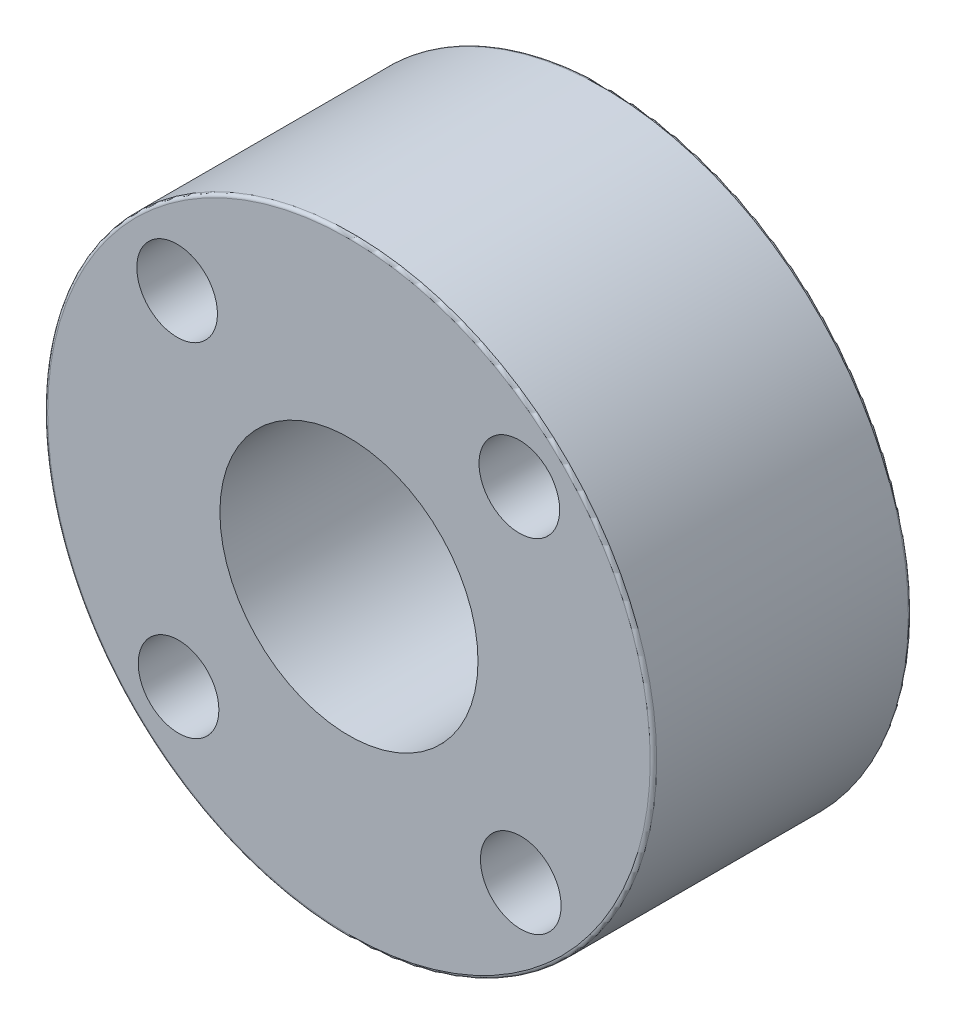
ISO-10303-21;
HEADER;
FILE_DESCRIPTION(('STEP AP214'),'2;1');
FILE_NAME('part.step','',(''),(''),'','','');
FILE_SCHEMA(('AUTOMOTIVE_DESIGN { 1 0 10303 214 1 1 1 1 }'));
ENDSEC;
DATA;
#1=APPLICATION_CONTEXT('core data for automotive mechanical design processes');
#2=APPLICATION_PROTOCOL_DEFINITION('international standard','automotive_design',2000,#1);
#3=PRODUCT_CONTEXT('',#1,'mechanical');
#4=PRODUCT('Part','Part','',(#3));
#5=PRODUCT_RELATED_PRODUCT_CATEGORY('part','',(#4));
#6=PRODUCT_DEFINITION_FORMATION('','',#4);
#7=PRODUCT_DEFINITION_CONTEXT('part definition',#1,'design');
#8=PRODUCT_DEFINITION('design','',#6,#7);
#9=PRODUCT_DEFINITION_SHAPE('','',#8);
#10=(LENGTH_UNIT() NAMED_UNIT(*) SI_UNIT(.MILLI.,.METRE.));
#11=(NAMED_UNIT(*) PLANE_ANGLE_UNIT() SI_UNIT($,.RADIAN.));
#12=(NAMED_UNIT(*) SI_UNIT($,.STERADIAN.) SOLID_ANGLE_UNIT());
#13=UNCERTAINTY_MEASURE_WITH_UNIT(LENGTH_MEASURE(1.E-05),#10,'distance_accuracy_value','');
#14=(GEOMETRIC_REPRESENTATION_CONTEXT(3) GLOBAL_UNCERTAINTY_ASSIGNED_CONTEXT((#13)) GLOBAL_UNIT_ASSIGNED_CONTEXT((#10,
#11,#12)) REPRESENTATION_CONTEXT('',''));
#15=CARTESIAN_POINT('',(0.,0.,0.));
#16=DIRECTION('',(0.,0.,1.));
#17=DIRECTION('',(1.,0.,0.));
#18=AXIS2_PLACEMENT_3D('',#15,#16,#17);
#19=CARTESIAN_POINT('',(0.,0.,8.));
#20=DIRECTION('',(0.,0.,1.));
#21=DIRECTION('',(1.,0.,0.));
#22=AXIS2_PLACEMENT_3D('',#19,#20,#21);
#23=PLANE('',#22);
#24=CARTESIAN_POINT('',(0.,0.,8.));
#25=DIRECTION('',(0.,0.,1.));
#26=DIRECTION('',(1.,0.,0.));
#27=AXIS2_PLACEMENT_3D('',#24,#25,#26);
#28=CIRCLE('',#27,9.33812854036816);
#29=CARTESIAN_POINT('',(9.33812854036816,0.,8.));
#30=VERTEX_POINT('',#29);
#31=EDGE_CURVE('E12',#30,#30,#28,.T.);
#32=ORIENTED_EDGE('',*,*,#31,.T.);
#33=EDGE_LOOP('',(#32));
#34=FACE_BOUND('',#33,.T.);
#35=CARTESIAN_POINT('',(5.32517198398644,-5.28133916170599,8.));
#36=DIRECTION('',(0.,0.,1.));
#37=DIRECTION('',(1.,0.,0.));
#38=AXIS2_PLACEMENT_3D('',#35,#36,#37);
#39=CIRCLE('',#38,1.25);
#40=CARTESIAN_POINT('',(6.57517198398644,-5.28133916170599,8.));
#41=VERTEX_POINT('',#40);
#42=EDGE_CURVE('E93',#41,#41,#39,.T.);
#43=ORIENTED_EDGE('',*,*,#42,.F.);
#44=EDGE_LOOP('',(#43));
#45=FACE_BOUND('',#44,.T.);
#46=CARTESIAN_POINT('',(-5.3251719839858,5.28133916170599,8.));
#47=DIRECTION('',(0.,0.,1.));
#48=DIRECTION('',(1.,0.,0.));
#49=AXIS2_PLACEMENT_3D('',#46,#47,#48);
#50=CIRCLE('',#49,1.25);
#51=CARTESIAN_POINT('',(-4.07517198398581,5.28133916170599,8.));
#52=VERTEX_POINT('',#51);
#53=EDGE_CURVE('E77',#52,#52,#50,.T.);
#54=ORIENTED_EDGE('',*,*,#53,.F.);
#55=EDGE_LOOP('',(#54));
#56=FACE_BOUND('',#55,.T.);
#57=CARTESIAN_POINT('',(0.,0.,8.));
#58=DIRECTION('',(0.,0.,1.));
#59=DIRECTION('',(1.,0.,0.));
#60=AXIS2_PLACEMENT_3D('',#57,#58,#59);
#61=CIRCLE('',#60,4.);
#62=CARTESIAN_POINT('',(4.,0.,8.));
#63=VERTEX_POINT('',#62);
#64=EDGE_CURVE('E72',#63,#63,#61,.T.);
#65=ORIENTED_EDGE('',*,*,#64,.F.);
#66=EDGE_LOOP('',(#65));
#67=FACE_BOUND('',#66,.T.);
#68=CARTESIAN_POINT('',(-5.28133916170567,-5.32517198398612,8.));
#69=DIRECTION('',(0.,0.,1.));
#70=DIRECTION('',(1.,0.,0.));
#71=AXIS2_PLACEMENT_3D('',#68,#69,#70);
#72=CIRCLE('',#71,1.25);
#73=CARTESIAN_POINT('',(-4.03133916170567,-5.32517198398612,8.));
#74=VERTEX_POINT('',#73);
#75=EDGE_CURVE('E85',#74,#74,#72,.T.);
#76=ORIENTED_EDGE('',*,*,#75,.F.);
#77=EDGE_LOOP('',(#76));
#78=FACE_BOUND('',#77,.T.);
#79=CARTESIAN_POINT('',(5.28133916170631,5.32517198398612,8.));
#80=DIRECTION('',(0.,0.,1.));
#81=DIRECTION('',(1.,0.,0.));
#82=AXIS2_PLACEMENT_3D('',#79,#80,#81);
#83=CIRCLE('',#82,1.25);
#84=CARTESIAN_POINT('',(6.53133916170631,5.32517198398612,8.));
#85=VERTEX_POINT('',#84);
#86=EDGE_CURVE('E101',#85,#85,#83,.T.);
#87=ORIENTED_EDGE('',*,*,#86,.F.);
#88=EDGE_LOOP('',(#87));
#89=FACE_BOUND('',#88,.T.);
#90=ADVANCED_FACE('F48',(#34,#45,#56,#67,#78,#89),#23,.T.);
#91=CARTESIAN_POINT('',(0.,0.,0.));
#92=DIRECTION('',(0.,0.,1.));
#93=DIRECTION('',(1.,0.,0.));
#94=AXIS2_PLACEMENT_3D('',#91,#92,#93);
#95=PLANE('',#94);
#96=CARTESIAN_POINT('',(0.,0.,0.));
#97=DIRECTION('',(0.,0.,1.));
#98=DIRECTION('',(1.,0.,0.));
#99=AXIS2_PLACEMENT_3D('',#96,#97,#98);
#100=CIRCLE('',#99,9.33812854036816);
#101=CARTESIAN_POINT('',(9.33812854036816,0.,0.));
#102=VERTEX_POINT('',#101);
#103=EDGE_CURVE('E56',#102,#102,#100,.F.);
#104=ORIENTED_EDGE('',*,*,#103,.T.);
#105=EDGE_LOOP('',(#104));
#106=FACE_BOUND('',#105,.T.);
#107=CARTESIAN_POINT('',(0.,0.,0.));
#108=DIRECTION('',(0.,0.,1.));
#109=DIRECTION('',(1.,0.,0.));
#110=AXIS2_PLACEMENT_3D('',#107,#108,#109);
#111=CIRCLE('',#110,4.);
#112=CARTESIAN_POINT('',(4.,0.,0.));
#113=VERTEX_POINT('',#112);
#114=EDGE_CURVE('E73',#113,#113,#111,.T.);
#115=ORIENTED_EDGE('',*,*,#114,.T.);
#116=EDGE_LOOP('',(#115));
#117=FACE_BOUND('',#116,.T.);
#118=CARTESIAN_POINT('',(-5.3251719839858,5.28133916170599,0.));
#119=DIRECTION('',(0.,0.,1.));
#120=DIRECTION('',(1.,0.,0.));
#121=AXIS2_PLACEMENT_3D('',#118,#119,#120);
#122=CIRCLE('',#121,1.25);
#123=CARTESIAN_POINT('',(-4.07517198398581,5.28133916170599,0.));
#124=VERTEX_POINT('',#123);
#125=EDGE_CURVE('E81',#124,#124,#122,.T.);
#126=ORIENTED_EDGE('',*,*,#125,.T.);
#127=EDGE_LOOP('',(#126));
#128=FACE_BOUND('',#127,.T.);
#129=CARTESIAN_POINT('',(-5.28133916170567,-5.32517198398612,0.));
#130=DIRECTION('',(0.,0.,1.));
#131=DIRECTION('',(1.,0.,0.));
#132=AXIS2_PLACEMENT_3D('',#129,#130,#131);
#133=CIRCLE('',#132,1.25);
#134=CARTESIAN_POINT('',(-4.03133916170567,-5.32517198398612,0.));
#135=VERTEX_POINT('',#134);
#136=EDGE_CURVE('E89',#135,#135,#133,.T.);
#137=ORIENTED_EDGE('',*,*,#136,.T.);
#138=EDGE_LOOP('',(#137));
#139=FACE_BOUND('',#138,.T.);
#140=CARTESIAN_POINT('',(5.32517198398644,-5.28133916170599,0.));
#141=DIRECTION('',(0.,0.,1.));
#142=DIRECTION('',(1.,0.,0.));
#143=AXIS2_PLACEMENT_3D('',#140,#141,#142);
#144=CIRCLE('',#143,1.25);
#145=CARTESIAN_POINT('',(6.57517198398644,-5.28133916170599,0.));
#146=VERTEX_POINT('',#145);
#147=EDGE_CURVE('E97',#146,#146,#144,.T.);
#148=ORIENTED_EDGE('',*,*,#147,.T.);
#149=EDGE_LOOP('',(#148));
#150=FACE_BOUND('',#149,.T.);
#151=CARTESIAN_POINT('',(5.28133916170631,5.32517198398612,0.));
#152=DIRECTION('',(0.,0.,1.));
#153=DIRECTION('',(1.,0.,0.));
#154=AXIS2_PLACEMENT_3D('',#151,#152,#153);
#155=CIRCLE('',#154,1.25);
#156=CARTESIAN_POINT('',(6.53133916170631,5.32517198398612,0.));
#157=VERTEX_POINT('',#156);
#158=EDGE_CURVE('E105',#157,#157,#155,.T.);
#159=ORIENTED_EDGE('',*,*,#158,.T.);
#160=EDGE_LOOP('',(#159));
#161=FACE_BOUND('',#160,.T.);
#162=ADVANCED_FACE('F117',(#106,#117,#128,#139,#150,#161),#95,.F.);
#163=CARTESIAN_POINT('',(0.,0.,8.));
#164=DIRECTION('',(0.,0.,-1.));
#165=DIRECTION('',(-1.,0.,0.));
#166=AXIS2_PLACEMENT_3D('',#163,#164,#165);
#167=CYLINDRICAL_SURFACE('',#166,9.43812854036816);
#168=CARTESIAN_POINT('',(0.,0.,0.0999999999999994));
#169=DIRECTION('',(0.,0.,1.));
#170=DIRECTION('',(1.,0.,0.));
#171=AXIS2_PLACEMENT_3D('',#168,#169,#170);
#172=CIRCLE('',#171,9.43812854036816);
#173=CARTESIAN_POINT('',(9.43812854036816,0.,0.0999999999999994));
#174=VERTEX_POINT('',#173);
#175=EDGE_CURVE('E61',#174,#174,#172,.T.);
#176=ORIENTED_EDGE('',*,*,#175,.T.);
#177=EDGE_LOOP('',(#176));
#178=FACE_BOUND('',#177,.T.);
#179=CARTESIAN_POINT('',(0.,0.,7.9));
#180=DIRECTION('',(0.,0.,1.));
#181=DIRECTION('',(1.,0.,0.));
#182=AXIS2_PLACEMENT_3D('',#179,#180,#181);
#183=CIRCLE('',#182,9.43812854036816);
#184=CARTESIAN_POINT('',(9.43812854036816,0.,7.9));
#185=VERTEX_POINT('',#184);
#186=EDGE_CURVE('E66',#185,#185,#183,.F.);
#187=ORIENTED_EDGE('',*,*,#186,.T.);
#188=EDGE_LOOP('',(#187));
#189=FACE_BOUND('',#188,.T.);
#190=ADVANCED_FACE('F122',(#178,#189),#167,.T.);
#191=CARTESIAN_POINT('',(0.,0.,8.));
#192=DIRECTION('',(0.,0.,-1.));
#193=DIRECTION('',(-1.,0.,0.));
#194=AXIS2_PLACEMENT_3D('',#191,#192,#193);
#195=CYLINDRICAL_SURFACE('',#194,4.);
#196=ORIENTED_EDGE('',*,*,#64,.T.);
#197=EDGE_LOOP('',(#196));
#198=FACE_BOUND('',#197,.T.);
#199=ORIENTED_EDGE('',*,*,#114,.F.);
#200=EDGE_LOOP('',(#199));
#201=FACE_BOUND('',#200,.T.);
#202=ADVANCED_FACE('F126',(#198,#201),#195,.F.);
#203=CARTESIAN_POINT('',(-5.3251719839858,5.28133916170599,8.));
#204=DIRECTION('',(0.,0.,-1.));
#205=DIRECTION('',(-1.,0.,0.));
#206=AXIS2_PLACEMENT_3D('',#203,#204,#205);
#207=CYLINDRICAL_SURFACE('',#206,1.25);
#208=ORIENTED_EDGE('',*,*,#53,.T.);
#209=EDGE_LOOP('',(#208));
#210=FACE_BOUND('',#209,.T.);
#211=ORIENTED_EDGE('',*,*,#125,.F.);
#212=EDGE_LOOP('',(#211));
#213=FACE_BOUND('',#212,.T.);
#214=ADVANCED_FACE('F154',(#210,#213),#207,.F.);
#215=CARTESIAN_POINT('',(-5.28133916170567,-5.32517198398612,8.));
#216=DIRECTION('',(0.,0.,-1.));
#217=DIRECTION('',(-1.,0.,0.));
#218=AXIS2_PLACEMENT_3D('',#215,#216,#217);
#219=CYLINDRICAL_SURFACE('',#218,1.25);
#220=ORIENTED_EDGE('',*,*,#75,.T.);
#221=EDGE_LOOP('',(#220));
#222=FACE_BOUND('',#221,.T.);
#223=ORIENTED_EDGE('',*,*,#136,.F.);
#224=EDGE_LOOP('',(#223));
#225=FACE_BOUND('',#224,.T.);
#226=ADVANCED_FACE('F149',(#222,#225),#219,.F.);
#227=CARTESIAN_POINT('',(5.32517198398644,-5.28133916170599,8.));
#228=DIRECTION('',(0.,0.,-1.));
#229=DIRECTION('',(-1.,0.,0.));
#230=AXIS2_PLACEMENT_3D('',#227,#228,#229);
#231=CYLINDRICAL_SURFACE('',#230,1.25);
#232=ORIENTED_EDGE('',*,*,#42,.T.);
#233=EDGE_LOOP('',(#232));
#234=FACE_BOUND('',#233,.T.);
#235=ORIENTED_EDGE('',*,*,#147,.F.);
#236=EDGE_LOOP('',(#235));
#237=FACE_BOUND('',#236,.T.);
#238=ADVANCED_FACE('F139',(#234,#237),#231,.F.);
#239=CARTESIAN_POINT('',(5.28133916170631,5.32517198398612,8.));
#240=DIRECTION('',(0.,0.,-1.));
#241=DIRECTION('',(-1.,0.,0.));
#242=AXIS2_PLACEMENT_3D('',#239,#240,#241);
#243=CYLINDRICAL_SURFACE('',#242,1.25);
#244=ORIENTED_EDGE('',*,*,#86,.T.);
#245=EDGE_LOOP('',(#244));
#246=FACE_BOUND('',#245,.T.);
#247=ORIENTED_EDGE('',*,*,#158,.F.);
#248=EDGE_LOOP('',(#247));
#249=FACE_BOUND('',#248,.T.);
#250=ADVANCED_FACE('F113',(#246,#249),#243,.F.);
#251=CARTESIAN_POINT('',(0.,0.,0.0999999999999994));
#252=DIRECTION('',(0.,0.,1.));
#253=DIRECTION('',(1.,0.,0.));
#254=AXIS2_PLACEMENT_3D('',#251,#252,#253);
#255=TOROIDAL_SURFACE('',#254,9.33812854036816,0.1);
#256=ORIENTED_EDGE('',*,*,#103,.F.);
#257=EDGE_LOOP('',(#256));
#258=FACE_BOUND('',#257,.T.);
#259=ORIENTED_EDGE('',*,*,#175,.F.);
#260=EDGE_LOOP('',(#259));
#261=FACE_BOUND('',#260,.T.);
#262=ADVANCED_FACE('F131',(#258,#261),#255,.T.);
#263=CARTESIAN_POINT('',(0.,0.,7.9));
#264=DIRECTION('',(0.,0.,1.));
#265=DIRECTION('',(1.,0.,0.));
#266=AXIS2_PLACEMENT_3D('',#263,#264,#265);
#267=TOROIDAL_SURFACE('',#266,9.33812854036816,0.1);
#268=ORIENTED_EDGE('',*,*,#186,.F.);
#269=EDGE_LOOP('',(#268));
#270=FACE_BOUND('',#269,.T.);
#271=ORIENTED_EDGE('',*,*,#31,.F.);
#272=EDGE_LOOP('',(#271));
#273=FACE_BOUND('',#272,.T.);
#274=ADVANCED_FACE('F50',(#270,#273),#267,.T.);
#275=CLOSED_SHELL('',(#90,#162,#190,#202,#214,#226,#238,#250,#262,#274));
#276=MANIFOLD_SOLID_BREP('B2',#275);
#277=ADVANCED_BREP_SHAPE_REPRESENTATION('',(#18,#276),#14);
#278=SHAPE_DEFINITION_REPRESENTATION(#9,#277);
ENDSEC;
END-ISO-10303-21;
